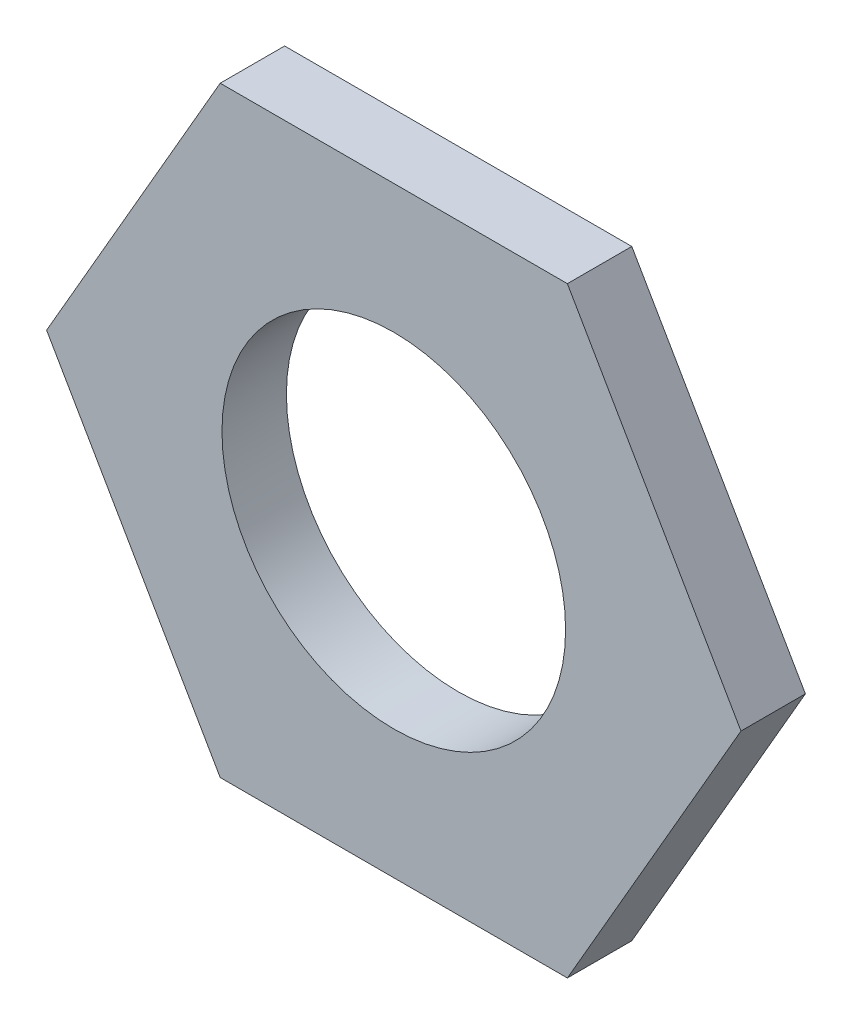
ISO-10303-21;
HEADER;
FILE_DESCRIPTION(('STEP AP214'),'2;1');
FILE_NAME('part.step','',(''),(''),'','','');
FILE_SCHEMA(('AUTOMOTIVE_DESIGN { 1 0 10303 214 1 1 1 1 }'));
ENDSEC;
DATA;
#1=APPLICATION_CONTEXT('core data for automotive mechanical design processes');
#2=APPLICATION_PROTOCOL_DEFINITION('international standard','automotive_design',2000,#1);
#3=PRODUCT_CONTEXT('',#1,'mechanical');
#4=PRODUCT('Part','Part','',(#3));
#5=PRODUCT_RELATED_PRODUCT_CATEGORY('part','',(#4));
#6=PRODUCT_DEFINITION_FORMATION('','',#4);
#7=PRODUCT_DEFINITION_CONTEXT('part definition',#1,'design');
#8=PRODUCT_DEFINITION('design','',#6,#7);
#9=PRODUCT_DEFINITION_SHAPE('','',#8);
#10=(LENGTH_UNIT() NAMED_UNIT(*) SI_UNIT(.MILLI.,.METRE.));
#11=(NAMED_UNIT(*) PLANE_ANGLE_UNIT() SI_UNIT($,.RADIAN.));
#12=(NAMED_UNIT(*) SI_UNIT($,.STERADIAN.) SOLID_ANGLE_UNIT());
#13=UNCERTAINTY_MEASURE_WITH_UNIT(LENGTH_MEASURE(1.E-05),#10,'distance_accuracy_value','');
#14=(GEOMETRIC_REPRESENTATION_CONTEXT(3) GLOBAL_UNCERTAINTY_ASSIGNED_CONTEXT((#13)) GLOBAL_UNIT_ASSIGNED_CONTEXT((#10,
#11,#12)) REPRESENTATION_CONTEXT('',''));
#15=CARTESIAN_POINT('',(0.,0.,0.));
#16=DIRECTION('',(0.,0.,1.));
#17=DIRECTION('',(1.,0.,0.));
#18=AXIS2_PLACEMENT_3D('',#15,#16,#17);
#19=CARTESIAN_POINT('',(0.,0.,1.5));
#20=DIRECTION('',(0.,0.,1.));
#21=DIRECTION('',(1.,0.,0.));
#22=AXIS2_PLACEMENT_3D('',#19,#20,#21);
#23=PLANE('',#22);
#24=DIRECTION('',(0.5,-0.866025403784439,0.));
#25=VECTOR('',#24,1.);
#26=CARTESIAN_POINT('',(43.0990670461319,-61.9743537667185,1.5));
#27=LINE('',#26,#25);
#28=CARTESIAN_POINT('',(43.0990670461319,-61.9743537667185,1.5));
#29=VERTEX_POINT('',#28);
#30=CARTESIAN_POINT('',(47.1405189304592,-68.9743537667184,1.5));
#31=VERTEX_POINT('',#30);
#32=EDGE_CURVE('E129',#29,#31,#27,.T.);
#33=ORIENTED_EDGE('',*,*,#32,.T.);
#34=DIRECTION('',(1.,0.,0.));
#35=VECTOR('',#34,1.);
#36=CARTESIAN_POINT('',(47.1405189304592,-68.9743537667184,1.5));
#37=LINE('',#36,#35);
#38=CARTESIAN_POINT('',(55.223422699114,-68.9743537667184,1.5));
#39=VERTEX_POINT('',#38);
#40=EDGE_CURVE('E87',#31,#39,#37,.T.);
#41=ORIENTED_EDGE('',*,*,#40,.T.);
#42=DIRECTION('',(0.5,0.866025403784439,0.));
#43=VECTOR('',#42,1.);
#44=CARTESIAN_POINT('',(55.223422699114,-68.9743537667184,1.5));
#45=LINE('',#44,#43);
#46=CARTESIAN_POINT('',(59.2648745834414,-61.9743537667184,1.5));
#47=VERTEX_POINT('',#46);
#48=EDGE_CURVE('E100',#39,#47,#45,.T.);
#49=ORIENTED_EDGE('',*,*,#48,.T.);
#50=DIRECTION('',(-0.500000000000001,0.866025403784438,0.));
#51=VECTOR('',#50,1.);
#52=CARTESIAN_POINT('',(59.2648745834414,-61.9743537667184,1.5));
#53=LINE('',#52,#51);
#54=CARTESIAN_POINT('',(55.223422699114,-54.9743537667185,1.5));
#55=VERTEX_POINT('',#54);
#56=EDGE_CURVE('E94',#47,#55,#53,.T.);
#57=ORIENTED_EDGE('',*,*,#56,.T.);
#58=DIRECTION('',(-1.,0.,0.));
#59=VECTOR('',#58,1.);
#60=CARTESIAN_POINT('',(55.223422699114,-54.9743537667185,1.5));
#61=LINE('',#60,#59);
#62=CARTESIAN_POINT('',(47.1405189304592,-54.9743537667185,1.5));
#63=VERTEX_POINT('',#62);
#64=EDGE_CURVE('E98',#55,#63,#61,.T.);
#65=ORIENTED_EDGE('',*,*,#64,.T.);
#66=DIRECTION('',(-0.5,-0.866025403784439,0.));
#67=VECTOR('',#66,1.);
#68=CARTESIAN_POINT('',(47.1405189304592,-54.9743537667185,1.5));
#69=LINE('',#68,#67);
#70=EDGE_CURVE('E50',#63,#29,#69,.T.);
#71=ORIENTED_EDGE('',*,*,#70,.T.);
#72=EDGE_LOOP('',(#33,#41,#49,#57,#65,#71));
#73=FACE_BOUND('',#72,.T.);
#74=CARTESIAN_POINT('',(51.1819708147866,-61.9743537667184,1.5));
#75=DIRECTION('',(0.,0.,1.));
#76=DIRECTION('',(1.,0.,0.));
#77=AXIS2_PLACEMENT_3D('',#74,#75,#76);
#78=CIRCLE('',#77,4.);
#79=CARTESIAN_POINT('',(55.1819708147866,-61.9743537667184,1.5));
#80=VERTEX_POINT('',#79);
#81=EDGE_CURVE('E122',#80,#80,#78,.T.);
#82=ORIENTED_EDGE('',*,*,#81,.F.);
#83=EDGE_LOOP('',(#82));
#84=FACE_BOUND('',#83,.T.);
#85=ADVANCED_FACE('F33',(#73,#84),#23,.T.);
#86=CARTESIAN_POINT('',(0.,0.,0.));
#87=DIRECTION('',(0.,0.,1.));
#88=DIRECTION('',(1.,0.,0.));
#89=AXIS2_PLACEMENT_3D('',#86,#87,#88);
#90=PLANE('',#89);
#91=DIRECTION('',(0.5,-0.866025403784439,0.));
#92=VECTOR('',#91,1.);
#93=CARTESIAN_POINT('',(43.0990670461319,-61.9743537667185,0.));
#94=LINE('',#93,#92);
#95=CARTESIAN_POINT('',(43.0990670461319,-61.9743537667185,0.));
#96=VERTEX_POINT('',#95);
#97=CARTESIAN_POINT('',(47.1405189304592,-68.9743537667184,0.));
#98=VERTEX_POINT('',#97);
#99=EDGE_CURVE('E118',#96,#98,#94,.T.);
#100=ORIENTED_EDGE('',*,*,#99,.F.);
#101=DIRECTION('',(-0.5,-0.866025403784439,0.));
#102=VECTOR('',#101,1.);
#103=CARTESIAN_POINT('',(47.1405189304592,-54.9743537667185,0.));
#104=LINE('',#103,#102);
#105=CARTESIAN_POINT('',(47.1405189304592,-54.9743537667185,0.));
#106=VERTEX_POINT('',#105);
#107=EDGE_CURVE('E79',#106,#96,#104,.T.);
#108=ORIENTED_EDGE('',*,*,#107,.F.);
#109=DIRECTION('',(-1.,0.,0.));
#110=VECTOR('',#109,1.);
#111=CARTESIAN_POINT('',(55.223422699114,-54.9743537667185,0.));
#112=LINE('',#111,#110);
#113=CARTESIAN_POINT('',(55.223422699114,-54.9743537667185,0.));
#114=VERTEX_POINT('',#113);
#115=EDGE_CURVE('E73',#114,#106,#112,.T.);
#116=ORIENTED_EDGE('',*,*,#115,.F.);
#117=DIRECTION('',(-0.500000000000001,0.866025403784438,0.));
#118=VECTOR('',#117,1.);
#119=CARTESIAN_POINT('',(59.2648745834414,-61.9743537667184,0.));
#120=LINE('',#119,#118);
#121=CARTESIAN_POINT('',(59.2648745834414,-61.9743537667184,0.));
#122=VERTEX_POINT('',#121);
#123=EDGE_CURVE('E108',#122,#114,#120,.T.);
#124=ORIENTED_EDGE('',*,*,#123,.F.);
#125=DIRECTION('',(0.5,0.866025403784439,0.));
#126=VECTOR('',#125,1.);
#127=CARTESIAN_POINT('',(55.223422699114,-68.9743537667184,0.));
#128=LINE('',#127,#126);
#129=CARTESIAN_POINT('',(55.223422699114,-68.9743537667184,0.));
#130=VERTEX_POINT('',#129);
#131=EDGE_CURVE('E124',#130,#122,#128,.T.);
#132=ORIENTED_EDGE('',*,*,#131,.F.);
#133=DIRECTION('',(1.,0.,0.));
#134=VECTOR('',#133,1.);
#135=CARTESIAN_POINT('',(47.1405189304592,-68.9743537667184,0.));
#136=LINE('',#135,#134);
#137=EDGE_CURVE('E121',#98,#130,#136,.T.);
#138=ORIENTED_EDGE('',*,*,#137,.F.);
#139=EDGE_LOOP('',(#100,#108,#116,#124,#132,#138));
#140=FACE_BOUND('',#139,.T.);
#141=CARTESIAN_POINT('',(51.1819708147866,-61.9743537667184,0.));
#142=DIRECTION('',(0.,0.,1.));
#143=DIRECTION('',(1.,0.,0.));
#144=AXIS2_PLACEMENT_3D('',#141,#142,#143);
#145=CIRCLE('',#144,4.);
#146=CARTESIAN_POINT('',(55.1819708147866,-61.9743537667184,0.));
#147=VERTEX_POINT('',#146);
#148=EDGE_CURVE('E222',#147,#147,#145,.T.);
#149=ORIENTED_EDGE('',*,*,#148,.T.);
#150=EDGE_LOOP('',(#149));
#151=FACE_BOUND('',#150,.T.);
#152=ADVANCED_FACE('F138',(#140,#151),#90,.F.);
#153=CARTESIAN_POINT('',(43.0990670461319,-61.9743537667185,1.5));
#154=DIRECTION('',(0.866025403784439,0.5,0.));
#155=DIRECTION('',(-0.5,0.866025403784439,0.));
#156=AXIS2_PLACEMENT_3D('',#153,#154,#155);
#157=PLANE('',#156);
#158=ORIENTED_EDGE('',*,*,#99,.T.);
#159=DIRECTION('',(0.,0.,-1.));
#160=VECTOR('',#159,1.);
#161=CARTESIAN_POINT('',(47.1405189304592,-68.9743537667184,1.5));
#162=LINE('',#161,#160);
#163=EDGE_CURVE('E11',#31,#98,#162,.T.);
#164=ORIENTED_EDGE('',*,*,#163,.F.);
#165=ORIENTED_EDGE('',*,*,#32,.F.);
#166=DIRECTION('',(0.,0.,-1.));
#167=VECTOR('',#166,1.);
#168=CARTESIAN_POINT('',(43.0990670461319,-61.9743537667185,1.5));
#169=LINE('',#168,#167);
#170=EDGE_CURVE('E114',#29,#96,#169,.T.);
#171=ORIENTED_EDGE('',*,*,#170,.T.);
#172=EDGE_LOOP('',(#158,#164,#165,#171));
#173=FACE_BOUND('',#172,.T.);
#174=ADVANCED_FACE('F35',(#173),#157,.F.);
#175=CARTESIAN_POINT('',(47.1405189304592,-68.9743537667184,1.5));
#176=DIRECTION('',(0.,1.,0.));
#177=DIRECTION('',(0.,0.,1.));
#178=AXIS2_PLACEMENT_3D('',#175,#176,#177);
#179=PLANE('',#178);
#180=ORIENTED_EDGE('',*,*,#137,.T.);
#181=DIRECTION('',(0.,0.,-1.));
#182=VECTOR('',#181,1.);
#183=CARTESIAN_POINT('',(55.223422699114,-68.9743537667184,1.5));
#184=LINE('',#183,#182);
#185=EDGE_CURVE('E42',#39,#130,#184,.T.);
#186=ORIENTED_EDGE('',*,*,#185,.F.);
#187=ORIENTED_EDGE('',*,*,#40,.F.);
#188=ORIENTED_EDGE('',*,*,#163,.T.);
#189=EDGE_LOOP('',(#180,#186,#187,#188));
#190=FACE_BOUND('',#189,.T.);
#191=ADVANCED_FACE('F163',(#190),#179,.F.);
#192=CARTESIAN_POINT('',(55.223422699114,-68.9743537667184,1.5));
#193=DIRECTION('',(-0.866025403784439,0.5,0.));
#194=DIRECTION('',(-0.5,-0.866025403784439,0.));
#195=AXIS2_PLACEMENT_3D('',#192,#193,#194);
#196=PLANE('',#195);
#197=ORIENTED_EDGE('',*,*,#131,.T.);
#198=DIRECTION('',(0.,0.,-1.));
#199=VECTOR('',#198,1.);
#200=CARTESIAN_POINT('',(59.2648745834414,-61.9743537667184,1.5));
#201=LINE('',#200,#199);
#202=EDGE_CURVE('E109',#47,#122,#201,.T.);
#203=ORIENTED_EDGE('',*,*,#202,.F.);
#204=ORIENTED_EDGE('',*,*,#48,.F.);
#205=ORIENTED_EDGE('',*,*,#185,.T.);
#206=EDGE_LOOP('',(#197,#203,#204,#205));
#207=FACE_BOUND('',#206,.T.);
#208=ADVANCED_FACE('F135',(#207),#196,.F.);
#209=CARTESIAN_POINT('',(59.2648745834414,-61.9743537667184,1.5));
#210=DIRECTION('',(-0.866025403784438,-0.500000000000001,0.));
#211=DIRECTION('',(0.500000000000001,-0.866025403784438,0.));
#212=AXIS2_PLACEMENT_3D('',#209,#210,#211);
#213=PLANE('',#212);
#214=ORIENTED_EDGE('',*,*,#123,.T.);
#215=DIRECTION('',(0.,0.,-1.));
#216=VECTOR('',#215,1.);
#217=CARTESIAN_POINT('',(55.223422699114,-54.9743537667185,1.5));
#218=LINE('',#217,#216);
#219=EDGE_CURVE('E105',#55,#114,#218,.T.);
#220=ORIENTED_EDGE('',*,*,#219,.F.);
#221=ORIENTED_EDGE('',*,*,#56,.F.);
#222=ORIENTED_EDGE('',*,*,#202,.T.);
#223=EDGE_LOOP('',(#214,#220,#221,#222));
#224=FACE_BOUND('',#223,.T.);
#225=ADVANCED_FACE('F106',(#224),#213,.F.);
#226=CARTESIAN_POINT('',(55.223422699114,-54.9743537667185,1.5));
#227=DIRECTION('',(0.,-1.,0.));
#228=DIRECTION('',(0.,0.,-1.));
#229=AXIS2_PLACEMENT_3D('',#226,#227,#228);
#230=PLANE('',#229);
#231=ORIENTED_EDGE('',*,*,#115,.T.);
#232=DIRECTION('',(0.,0.,-1.));
#233=VECTOR('',#232,1.);
#234=CARTESIAN_POINT('',(47.1405189304592,-54.9743537667185,1.5));
#235=LINE('',#234,#233);
#236=EDGE_CURVE('E110',#63,#106,#235,.T.);
#237=ORIENTED_EDGE('',*,*,#236,.F.);
#238=ORIENTED_EDGE('',*,*,#64,.F.);
#239=ORIENTED_EDGE('',*,*,#219,.T.);
#240=EDGE_LOOP('',(#231,#237,#238,#239));
#241=FACE_BOUND('',#240,.T.);
#242=ADVANCED_FACE('F112',(#241),#230,.F.);
#243=CARTESIAN_POINT('',(47.1405189304592,-54.9743537667185,1.5));
#244=DIRECTION('',(0.866025403784439,-0.5,0.));
#245=DIRECTION('',(0.5,0.866025403784439,0.));
#246=AXIS2_PLACEMENT_3D('',#243,#244,#245);
#247=PLANE('',#246);
#248=ORIENTED_EDGE('',*,*,#107,.T.);
#249=ORIENTED_EDGE('',*,*,#170,.F.);
#250=ORIENTED_EDGE('',*,*,#70,.F.);
#251=ORIENTED_EDGE('',*,*,#236,.T.);
#252=EDGE_LOOP('',(#248,#249,#250,#251));
#253=FACE_BOUND('',#252,.T.);
#254=ADVANCED_FACE('F143',(#253),#247,.F.);
#255=CARTESIAN_POINT('',(51.1819708147866,-61.9743537667184,1.5));
#256=DIRECTION('',(0.,0.,-1.));
#257=DIRECTION('',(-1.,0.,0.));
#258=AXIS2_PLACEMENT_3D('',#255,#256,#257);
#259=CYLINDRICAL_SURFACE('',#258,4.);
#260=ORIENTED_EDGE('',*,*,#81,.T.);
#261=EDGE_LOOP('',(#260));
#262=FACE_BOUND('',#261,.T.);
#263=ORIENTED_EDGE('',*,*,#148,.F.);
#264=EDGE_LOOP('',(#263));
#265=FACE_BOUND('',#264,.T.);
#266=ADVANCED_FACE('F145',(#262,#265),#259,.F.);
#267=CLOSED_SHELL('',(#85,#152,#174,#191,#208,#225,#242,#254,#266));
#268=MANIFOLD_SOLID_BREP('B2',#267);
#269=ADVANCED_BREP_SHAPE_REPRESENTATION('',(#18,#268),#14);
#270=SHAPE_DEFINITION_REPRESENTATION(#9,#269);
ENDSEC;
END-ISO-10303-21;
